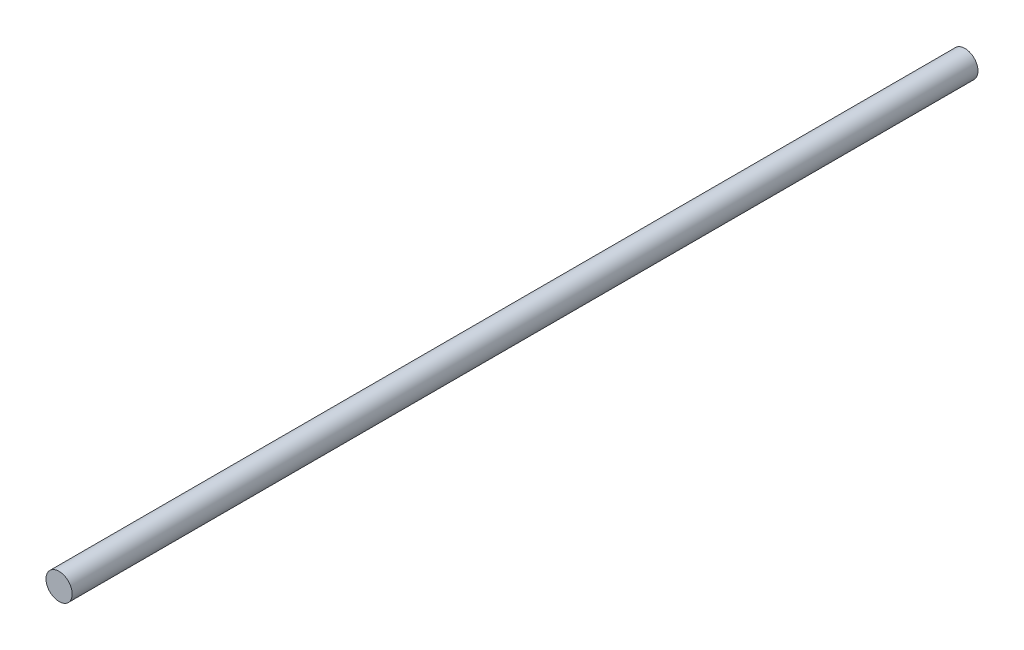
ISO-10303-21;
HEADER;
FILE_DESCRIPTION(('STEP AP214'),'2;1');
FILE_NAME('part.step','',(''),(''),'','','');
FILE_SCHEMA(('AUTOMOTIVE_DESIGN { 1 0 10303 214 1 1 1 1 }'));
ENDSEC;
DATA;
#1=APPLICATION_CONTEXT('core data for automotive mechanical design processes');
#2=APPLICATION_PROTOCOL_DEFINITION('international standard','automotive_design',2000,#1);
#3=PRODUCT_CONTEXT('',#1,'mechanical');
#4=PRODUCT('Part','Part','',(#3));
#5=PRODUCT_RELATED_PRODUCT_CATEGORY('part','',(#4));
#6=PRODUCT_DEFINITION_FORMATION('','',#4);
#7=PRODUCT_DEFINITION_CONTEXT('part definition',#1,'design');
#8=PRODUCT_DEFINITION('design','',#6,#7);
#9=PRODUCT_DEFINITION_SHAPE('','',#8);
#10=(LENGTH_UNIT() NAMED_UNIT(*) SI_UNIT(.MILLI.,.METRE.));
#11=(NAMED_UNIT(*) PLANE_ANGLE_UNIT() SI_UNIT($,.RADIAN.));
#12=(NAMED_UNIT(*) SI_UNIT($,.STERADIAN.) SOLID_ANGLE_UNIT());
#13=UNCERTAINTY_MEASURE_WITH_UNIT(LENGTH_MEASURE(1.E-05),#10,'distance_accuracy_value','');
#14=(GEOMETRIC_REPRESENTATION_CONTEXT(3) GLOBAL_UNCERTAINTY_ASSIGNED_CONTEXT((#13)) GLOBAL_UNIT_ASSIGNED_CONTEXT((#10,
#11,#12)) REPRESENTATION_CONTEXT('',''));
#15=CARTESIAN_POINT('',(0.,0.,0.));
#16=DIRECTION('',(0.,0.,1.));
#17=DIRECTION('',(1.,0.,0.));
#18=AXIS2_PLACEMENT_3D('',#15,#16,#17);
#19=CARTESIAN_POINT('',(0.,0.,414.6));
#20=DIRECTION('',(0.,0.,-1.));
#21=DIRECTION('',(-1.,0.,0.));
#22=AXIS2_PLACEMENT_3D('',#19,#20,#21);
#23=CYLINDRICAL_SURFACE('',#22,6.);
#24=CARTESIAN_POINT('',(0.,0.,414.6));
#25=DIRECTION('',(0.,0.,1.));
#26=DIRECTION('',(1.,0.,0.));
#27=AXIS2_PLACEMENT_3D('',#24,#25,#26);
#28=CIRCLE('',#27,6.);
#29=CARTESIAN_POINT('',(6.,0.,414.6));
#30=VERTEX_POINT('',#29);
#31=EDGE_CURVE('E10',#30,#30,#28,.T.);
#32=ORIENTED_EDGE('',*,*,#31,.F.);
#33=EDGE_LOOP('',(#32));
#34=FACE_BOUND('',#33,.T.);
#35=CARTESIAN_POINT('',(0.,0.,0.));
#36=DIRECTION('',(0.,0.,1.));
#37=DIRECTION('',(1.,0.,0.));
#38=AXIS2_PLACEMENT_3D('',#35,#36,#37);
#39=CIRCLE('',#38,6.);
#40=CARTESIAN_POINT('',(6.,0.,0.));
#41=VERTEX_POINT('',#40);
#42=EDGE_CURVE('E34',#41,#41,#39,.T.);
#43=ORIENTED_EDGE('',*,*,#42,.T.);
#44=EDGE_LOOP('',(#43));
#45=FACE_BOUND('',#44,.T.);
#46=ADVANCED_FACE('F31',(#34,#45),#23,.T.);
#47=CARTESIAN_POINT('',(0.,0.,414.6));
#48=DIRECTION('',(0.,0.,1.));
#49=DIRECTION('',(1.,0.,0.));
#50=AXIS2_PLACEMENT_3D('',#47,#48,#49);
#51=PLANE('',#50);
#52=ORIENTED_EDGE('',*,*,#31,.T.);
#53=EDGE_LOOP('',(#52));
#54=FACE_BOUND('',#53,.T.);
#55=ADVANCED_FACE('F46',(#54),#51,.T.);
#56=CARTESIAN_POINT('',(0.,0.,0.));
#57=DIRECTION('',(0.,0.,1.));
#58=DIRECTION('',(1.,0.,0.));
#59=AXIS2_PLACEMENT_3D('',#56,#57,#58);
#60=PLANE('',#59);
#61=ORIENTED_EDGE('',*,*,#42,.F.);
#62=EDGE_LOOP('',(#61));
#63=FACE_BOUND('',#62,.T.);
#64=ADVANCED_FACE('F44',(#63),#60,.F.);
#65=CLOSED_SHELL('',(#46,#55,#64));
#66=MANIFOLD_SOLID_BREP('B2',#65);
#67=ADVANCED_BREP_SHAPE_REPRESENTATION('',(#18,#66),#14);
#68=SHAPE_DEFINITION_REPRESENTATION(#9,#67);
ENDSEC;
END-ISO-10303-21;
